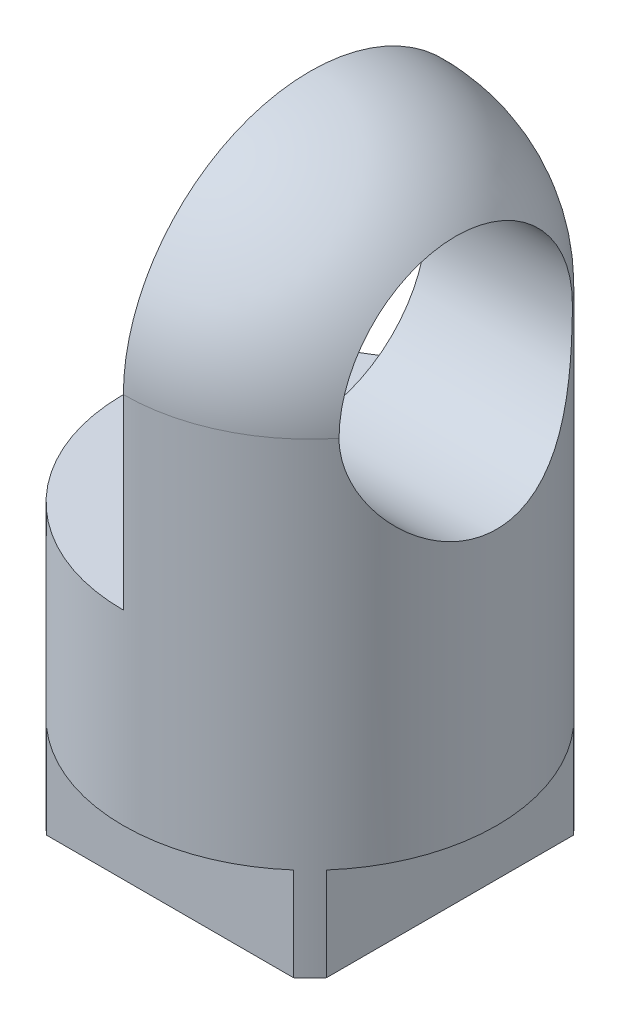
ISO-10303-21;
HEADER;
FILE_DESCRIPTION(('STEP AP214'),'2;1');
FILE_NAME('part.step','',(''),(''),'','','');
FILE_SCHEMA(('AUTOMOTIVE_DESIGN { 1 0 10303 214 1 1 1 1 }'));
ENDSEC;
DATA;
#1=APPLICATION_CONTEXT('core data for automotive mechanical design processes');
#2=APPLICATION_PROTOCOL_DEFINITION('international standard','automotive_design',2000,#1);
#3=PRODUCT_CONTEXT('',#1,'mechanical');
#4=PRODUCT('Part','Part','',(#3));
#5=PRODUCT_RELATED_PRODUCT_CATEGORY('part','',(#4));
#6=PRODUCT_DEFINITION_FORMATION('','',#4);
#7=PRODUCT_DEFINITION_CONTEXT('part definition',#1,'design');
#8=PRODUCT_DEFINITION('design','',#6,#7);
#9=PRODUCT_DEFINITION_SHAPE('','',#8);
#10=(LENGTH_UNIT() NAMED_UNIT(*) SI_UNIT(.MILLI.,.METRE.));
#11=(NAMED_UNIT(*) PLANE_ANGLE_UNIT() SI_UNIT($,.RADIAN.));
#12=(NAMED_UNIT(*) SI_UNIT($,.STERADIAN.) SOLID_ANGLE_UNIT());
#13=UNCERTAINTY_MEASURE_WITH_UNIT(LENGTH_MEASURE(1.E-05),#10,'distance_accuracy_value','');
#14=(GEOMETRIC_REPRESENTATION_CONTEXT(3) GLOBAL_UNCERTAINTY_ASSIGNED_CONTEXT((#13)) GLOBAL_UNIT_ASSIGNED_CONTEXT((#10,
#11,#12)) REPRESENTATION_CONTEXT('',''));
#15=CARTESIAN_POINT('',(0.,0.,0.));
#16=DIRECTION('',(0.,0.,1.));
#17=DIRECTION('',(1.,0.,0.));
#18=AXIS2_PLACEMENT_3D('',#15,#16,#17);
#19=CARTESIAN_POINT('',(0.,12.7,0.));
#20=DIRECTION('',(0.,1.,0.));
#21=DIRECTION('',(-1.,0.,0.));
#22=AXIS2_PLACEMENT_3D('',#19,#20,#21);
#23=CYLINDRICAL_SURFACE('',#22,5.08);
#24=CARTESIAN_POINT('',(0.,0.,0.));
#25=DIRECTION('',(0.,1.,0.));
#26=DIRECTION('',(-1.,0.,0.));
#27=AXIS2_PLACEMENT_3D('',#24,#25,#26);
#28=CIRCLE('',#27,5.08);
#29=CARTESIAN_POINT('',(3.36010416505203,0.,3.81));
#30=VERTEX_POINT('',#29);
#31=CARTESIAN_POINT('',(3.81,0.,3.36010416505203));
#32=VERTEX_POINT('',#31);
#33=EDGE_CURVE('E156',#30,#32,#28,.T.);
#34=ORIENTED_EDGE('',*,*,#33,.T.);
#35=DIRECTION('',(0.,1.,0.));
#36=VECTOR('',#35,1.);
#37=CARTESIAN_POINT('',(3.81,12.7,3.36010416505203));
#38=LINE('',#37,#36);
#39=CARTESIAN_POINT('',(3.81,2.54,3.36010416505203));
#40=VERTEX_POINT('',#39);
#41=EDGE_CURVE('E171',#32,#40,#38,.T.);
#42=ORIENTED_EDGE('',*,*,#41,.T.);
#43=CARTESIAN_POINT('',(0.,2.54,0.));
#44=DIRECTION('',(0.,1.,0.));
#45=DIRECTION('',(0.,0.,1.));
#46=AXIS2_PLACEMENT_3D('',#43,#44,#45);
#47=CIRCLE('',#46,5.08);
#48=CARTESIAN_POINT('',(3.81,2.54,-3.36010416505203));
#49=VERTEX_POINT('',#48);
#50=EDGE_CURVE('E11',#40,#49,#47,.T.);
#51=ORIENTED_EDGE('',*,*,#50,.T.);
#52=DIRECTION('',(0.,1.,0.));
#53=VECTOR('',#52,1.);
#54=CARTESIAN_POINT('',(3.81,12.7,-3.36010416505203));
#55=LINE('',#54,#53);
#56=CARTESIAN_POINT('',(3.81,0.,-3.36010416505203));
#57=VERTEX_POINT('',#56);
#58=EDGE_CURVE('E391',#49,#57,#55,.F.);
#59=ORIENTED_EDGE('',*,*,#58,.T.);
#60=CARTESIAN_POINT('',(3.36010416505203,0.,-3.81));
#61=VERTEX_POINT('',#60);
#62=EDGE_CURVE('E150',#57,#61,#28,.T.);
#63=ORIENTED_EDGE('',*,*,#62,.T.);
#64=DIRECTION('',(0.,1.,0.));
#65=VECTOR('',#64,1.);
#66=CARTESIAN_POINT('',(3.36010416505203,12.7,-3.81));
#67=LINE('',#66,#65);
#68=CARTESIAN_POINT('',(3.36010416505203,2.54,-3.81));
#69=VERTEX_POINT('',#68);
#70=EDGE_CURVE('E65',#69,#61,#67,.F.);
#71=ORIENTED_EDGE('',*,*,#70,.F.);
#72=CARTESIAN_POINT('',(-3.36010416505203,2.54,-3.81));
#73=VERTEX_POINT('',#72);
#74=EDGE_CURVE('E50',#69,#73,#47,.T.);
#75=ORIENTED_EDGE('',*,*,#74,.T.);
#76=DIRECTION('',(0.,1.,0.));
#77=VECTOR('',#76,1.);
#78=CARTESIAN_POINT('',(-3.36010416505203,12.7,-3.81));
#79=LINE('',#78,#77);
#80=CARTESIAN_POINT('',(-3.36010416505203,0.,-3.81));
#81=VERTEX_POINT('',#80);
#82=EDGE_CURVE('E127',#81,#73,#79,.T.);
#83=ORIENTED_EDGE('',*,*,#82,.F.);
#84=CARTESIAN_POINT('',(-3.81,0.,-3.36010416505203));
#85=VERTEX_POINT('',#84);
#86=EDGE_CURVE('E142',#81,#85,#28,.T.);
#87=ORIENTED_EDGE('',*,*,#86,.T.);
#88=DIRECTION('',(0.,1.,0.));
#89=VECTOR('',#88,1.);
#90=CARTESIAN_POINT('',(-3.81,12.7,-3.36010416505203));
#91=LINE('',#90,#89);
#92=CARTESIAN_POINT('',(-3.81,2.54,-3.36010416505203));
#93=VERTEX_POINT('',#92);
#94=EDGE_CURVE('E57',#93,#85,#91,.F.);
#95=ORIENTED_EDGE('',*,*,#94,.F.);
#96=CARTESIAN_POINT('',(-3.81,2.54,3.36010416505203));
#97=VERTEX_POINT('',#96);
#98=EDGE_CURVE('E182',#93,#97,#47,.T.);
#99=ORIENTED_EDGE('',*,*,#98,.T.);
#100=DIRECTION('',(0.,1.,0.));
#101=VECTOR('',#100,1.);
#102=CARTESIAN_POINT('',(-3.81,12.7,3.36010416505203));
#103=LINE('',#102,#101);
#104=CARTESIAN_POINT('',(-3.81,0.,3.36010416505203));
#105=VERTEX_POINT('',#104);
#106=EDGE_CURVE('E405',#105,#97,#103,.T.);
#107=ORIENTED_EDGE('',*,*,#106,.F.);
#108=CARTESIAN_POINT('',(-3.36010416505203,0.,3.81));
#109=VERTEX_POINT('',#108);
#110=EDGE_CURVE('E153',#105,#109,#28,.T.);
#111=ORIENTED_EDGE('',*,*,#110,.T.);
#112=DIRECTION('',(0.,1.,0.));
#113=VECTOR('',#112,1.);
#114=CARTESIAN_POINT('',(-3.36010416505203,12.7,3.81));
#115=LINE('',#114,#113);
#116=CARTESIAN_POINT('',(-3.36010416505203,2.54,3.81));
#117=VERTEX_POINT('',#116);
#118=EDGE_CURVE('E393',#109,#117,#115,.T.);
#119=ORIENTED_EDGE('',*,*,#118,.T.);
#120=CARTESIAN_POINT('',(3.36010416505203,2.54,3.81));
#121=VERTEX_POINT('',#120);
#122=EDGE_CURVE('E44',#117,#121,#47,.T.);
#123=ORIENTED_EDGE('',*,*,#122,.T.);
#124=DIRECTION('',(0.,1.,0.));
#125=VECTOR('',#124,1.);
#126=CARTESIAN_POINT('',(3.36010416505203,12.7,3.81));
#127=LINE('',#126,#125);
#128=EDGE_CURVE('E173',#121,#30,#127,.F.);
#129=ORIENTED_EDGE('',*,*,#128,.T.);
#130=EDGE_LOOP('',(#34,#42,#51,#59,#63,#71,#75,#83,#87,#95,#99,#107,#111,#119,#123,#129));
#131=FACE_BOUND('',#130,.T.);
#132=CARTESIAN_POINT('',(0.,12.7,0.));
#133=DIRECTION('',(0.,1.,0.));
#134=DIRECTION('',(-1.,0.,0.));
#135=AXIS2_PLACEMENT_3D('',#132,#133,#134);
#136=CIRCLE('',#135,5.08);
#137=CARTESIAN_POINT('',(3.96557372898298,12.7,-3.175));
#138=VERTEX_POINT('',#137);
#139=CARTESIAN_POINT('',(0.,12.7,-5.08));
#140=VERTEX_POINT('',#139);
#141=EDGE_CURVE('E162',#138,#140,#136,.T.);
#142=ORIENTED_EDGE('',*,*,#141,.F.);
#143=CARTESIAN_POINT('',(3.96557372898298,12.7,-3.175));
#144=CARTESIAN_POINT('',(3.96553668575496,12.6205118891632,-3.1750187697658));
#145=CARTESIAN_POINT('',(3.96796270587859,12.5410459691146,-3.17201574642022));
#146=CARTESIAN_POINT('',(3.97745784475577,12.3829205182652,-3.16011597778468));
#147=CARTESIAN_POINT('',(3.98452187418947,12.304260199448,-3.15122569253627));
#148=CARTESIAN_POINT('',(4.00293106172696,12.1490062257853,-3.127802564909));
#149=CARTESIAN_POINT('',(4.01423860397452,12.0724005709671,-3.11331926895949));
#150=CARTESIAN_POINT('',(4.04065899806674,11.9210876587645,-3.07895209486733));
#151=CARTESIAN_POINT('',(4.05577272698305,11.8463808433099,-3.05906697188136));
#152=CARTESIAN_POINT('',(4.10586018242097,11.6264063356626,-2.99189347269355));
#153=CARTESIAN_POINT('',(4.14568267987246,11.4845009197178,-2.93696488170395));
#154=CARTESIAN_POINT('',(4.23363099607258,11.2118352331035,-2.80870324977392));
#155=CARTESIAN_POINT('',(4.28177726022103,11.0811036185818,-2.73532468421232));
#156=CARTESIAN_POINT('',(4.38861555354015,10.8156349938689,-2.56090465668066));
#157=CARTESIAN_POINT('',(4.44785842960661,10.6826788735131,-2.45748173299343));
#158=CARTESIAN_POINT('',(4.56574853837926,10.4345637702691,-2.2308537354882));
#159=CARTESIAN_POINT('',(4.62439553592428,10.3194115768122,-2.107641151329));
#160=CARTESIAN_POINT('',(4.74293376739633,10.0962252367574,-1.82669693037059));
#161=CARTESIAN_POINT('',(4.80211852737148,9.99073392818562,-1.66659303565518));
#162=CARTESIAN_POINT('',(4.88069787250447,9.85451479801774,-1.41178991041131));
#163=CARTESIAN_POINT('',(4.90519760483987,9.8127681594814,-1.32438379192686));
#164=CARTESIAN_POINT('',(4.95008316597792,9.7371498700146,-1.14523985655597));
#165=CARTESIAN_POINT('',(4.9704718365154,9.70327277685071,-1.05350508631344));
#166=CARTESIAN_POINT('',(5.00464782592636,9.64694057414909,-0.875919456573036));
#167=CARTESIAN_POINT('',(5.018894379992,9.62367653268437,-0.790412578673272));
#168=CARTESIAN_POINT('',(5.04312223051952,9.58430616521734,-0.617217250291774));
#169=CARTESIAN_POINT('',(5.05310598952021,9.56819570650549,-0.529530090387908));
#170=CARTESIAN_POINT('',(5.06851244575877,9.5433975208991,-0.352762535037775));
#171=CARTESIAN_POINT('',(5.07393795439694,9.53470521864252,-0.263683032938001));
#172=CARTESIAN_POINT('',(5.08007778745085,9.52487399982992,-0.0849777047656704));
#173=CARTESIAN_POINT('',(5.0807926541362,9.52373421385943,0.00464805723474299));
#174=CARTESIAN_POINT('',(5.07624689021295,9.53100123114147,0.248977181991278));
#175=CARTESIAN_POINT('',(5.06624641734615,9.54697928851916,0.40345581163355));
#176=CARTESIAN_POINT('',(5.03289450623881,9.60085729456019,0.706928183947302));
#177=CARTESIAN_POINT('',(5.00954204591595,9.63875892145516,0.855921505794065));
#178=CARTESIAN_POINT('',(4.95142655443309,9.73481631277104,1.14525432498885));
#179=CARTESIAN_POINT('',(4.91663404959704,9.79302441787137,1.28557034521797));
#180=CARTESIAN_POINT('',(4.83833326570713,9.92751369609217,1.55453752187429));
#181=CARTESIAN_POINT('',(4.79482346096385,10.0037980333166,1.68318663064181));
#182=CARTESIAN_POINT('',(4.6962961870067,10.1829178381142,1.94234884216889));
#183=CARTESIAN_POINT('',(4.64052057602974,10.2878748368373,2.07110651896006));
#184=CARTESIAN_POINT('',(4.52618792094146,10.5158827009064,2.31033793468988));
#185=CARTESIAN_POINT('',(4.46762601571075,10.6389660372124,2.42077808916699));
#186=CARTESIAN_POINT('',(4.34513887339685,10.9189038007104,2.63501018081984));
#187=CARTESIAN_POINT('',(4.28152109901661,11.0780707488094,2.73601785648001));
#188=CARTESIAN_POINT('',(4.19470545974723,11.3303372169517,2.86593372296078));
#189=CARTESIAN_POINT('',(4.16722823673247,11.4165738760507,2.90560711905144));
#190=CARTESIAN_POINT('',(4.11625294350117,11.5932461145547,2.97738017894082));
#191=CARTESIAN_POINT('',(4.09275160693284,11.68367816867,3.00948606836504));
#192=CARTESIAN_POINT('',(4.05517306813677,11.8492613231588,3.05986096965577));
#193=CARTESIAN_POINT('',(4.04015151928276,11.9237491199233,3.07961715063565));
#194=CARTESIAN_POINT('',(4.01390103952476,12.0745866550977,3.11375328898331));
#195=CARTESIAN_POINT('',(4.00267066936423,12.1509356750965,3.12813528679055));
#196=CARTESIAN_POINT('',(3.98438913827534,12.3056532829258,3.15139303049864));
#197=CARTESIAN_POINT('',(3.97737485192845,12.3840336088279,3.160220223687));
#198=CARTESIAN_POINT('',(3.96794588380327,12.5416017685572,3.17203674317549));
#199=CARTESIAN_POINT('',(3.9655368753038,12.6207904777237,3.1750188690043));
#200=CARTESIAN_POINT('',(3.96557372898298,12.7,3.175));
#201=B_SPLINE_CURVE_WITH_KNOTS('',3,(#143,#144,#145,#146,#147,#148,#149,#150,#151,#152,#153,
#154,#155,#156,#157,#158,#159,#160,#161,#162,#163,#164,#165,#166,#167,#168,#169,#170,#171,#172,
#173,#174,#175,#176,#177,#178,#179,#180,#181,#182,#183,#184,#185,#186,#187,#188,#189,#190,#191,
#192,#193,#194,#195,#196,#197,#198,#199,#200),.UNSPECIFIED.,.F.,.F.,(4,2,2,2,2,2,2,2,2,2,2,2,2,
2,2,2,2,2,2,2,2,2,2,2,2,2,2,2,4),(0.,0.238334741399563,0.476408392535931,0.71241970352417,
0.948485449188425,1.41824833158815,1.88918191081541,2.42276642713652,2.95655392380115,
3.55486271540028,3.85421010178217,4.15334985218028,4.42221814058601,4.69093089785872,
4.95947779875706,5.22799378510857,5.69240313299306,6.15684803574556,6.62249901642669,
7.08823156598375,7.61184583570854,8.13640976603913,8.7299577061444,9.02606457277424,
9.32192698169444,9.55719884046868,9.79238128157409,10.0295918199097,10.2670943919785),.UNSPECIFIED.);
#202=CARTESIAN_POINT('',(3.96557372898298,12.7,3.175));
#203=VERTEX_POINT('',#202);
#204=EDGE_CURVE('E207',#138,#203,#201,.T.);
#205=ORIENTED_EDGE('',*,*,#204,.T.);
#206=CARTESIAN_POINT('',(0.,12.7,5.08));
#207=VERTEX_POINT('',#206);
#208=EDGE_CURVE('E167',#207,#203,#136,.T.);
#209=ORIENTED_EDGE('',*,*,#208,.F.);
#210=DIRECTION('',(0.,1.,0.));
#211=VECTOR('',#210,1.);
#212=CARTESIAN_POINT('',(0.,12.7,5.08));
#213=LINE('',#212,#211);
#214=CARTESIAN_POINT('',(0.,7.62,5.08));
#215=VERTEX_POINT('',#214);
#216=EDGE_CURVE('E194',#215,#207,#213,.T.);
#217=ORIENTED_EDGE('',*,*,#216,.F.);
#218=CARTESIAN_POINT('',(0.,7.62,0.));
#219=DIRECTION('',(0.,1.,0.));
#220=DIRECTION('',(-1.,0.,0.));
#221=AXIS2_PLACEMENT_3D('',#218,#219,#220);
#222=CIRCLE('',#221,5.08);
#223=CARTESIAN_POINT('',(0.,7.62,-5.08));
#224=VERTEX_POINT('',#223);
#225=EDGE_CURVE('E190',#224,#215,#222,.T.);
#226=ORIENTED_EDGE('',*,*,#225,.F.);
#227=DIRECTION('',(0.,1.,0.));
#228=VECTOR('',#227,1.);
#229=CARTESIAN_POINT('',(0.,12.7,-5.08));
#230=LINE('',#229,#228);
#231=EDGE_CURVE('E135',#224,#140,#230,.T.);
#232=ORIENTED_EDGE('',*,*,#231,.T.);
#233=EDGE_LOOP('',(#142,#205,#209,#217,#226,#232));
#234=FACE_BOUND('',#233,.T.);
#235=ADVANCED_FACE('F40',(#131,#234),#23,.T.);
#236=CARTESIAN_POINT('',(0.,0.,0.));
#237=DIRECTION('',(0.,-1.,0.));
#238=DIRECTION('',(1.,0.,0.));
#239=AXIS2_PLACEMENT_3D('',#236,#237,#238);
#240=PLANE('',#239);
#241=DIRECTION('',(0.,0.,-1.));
#242=VECTOR('',#241,1.);
#243=CARTESIAN_POINT('',(3.81,0.,0.));
#244=LINE('',#243,#242);
#245=EDGE_CURVE('E176',#32,#57,#244,.T.);
#246=ORIENTED_EDGE('',*,*,#245,.F.);
#247=ORIENTED_EDGE('',*,*,#33,.F.);
#248=DIRECTION('',(1.,0.,0.));
#249=VECTOR('',#248,1.);
#250=CARTESIAN_POINT('',(0.,0.,3.81));
#251=LINE('',#250,#249);
#252=EDGE_CURVE('E175',#109,#30,#251,.T.);
#253=ORIENTED_EDGE('',*,*,#252,.F.);
#254=ORIENTED_EDGE('',*,*,#110,.F.);
#255=DIRECTION('',(0.,0.,-1.));
#256=VECTOR('',#255,1.);
#257=CARTESIAN_POINT('',(-3.81,0.,0.));
#258=LINE('',#257,#256);
#259=EDGE_CURVE('E134',#105,#85,#258,.T.);
#260=ORIENTED_EDGE('',*,*,#259,.T.);
#261=ORIENTED_EDGE('',*,*,#86,.F.);
#262=DIRECTION('',(1.,0.,0.));
#263=VECTOR('',#262,1.);
#264=CARTESIAN_POINT('',(0.,0.,-3.81));
#265=LINE('',#264,#263);
#266=EDGE_CURVE('E124',#81,#61,#265,.T.);
#267=ORIENTED_EDGE('',*,*,#266,.T.);
#268=ORIENTED_EDGE('',*,*,#62,.F.);
#269=EDGE_LOOP('',(#246,#247,#253,#254,#260,#261,#267,#268));
#270=FACE_BOUND('',#269,.T.);
#271=CARTESIAN_POINT('',(0.,0.,0.));
#272=DIRECTION('',(0.,-1.,0.));
#273=DIRECTION('',(1.,0.,0.));
#274=AXIS2_PLACEMENT_3D('',#271,#272,#273);
#275=CIRCLE('',#274,3.175);
#276=CARTESIAN_POINT('',(3.175,0.,0.));
#277=VERTEX_POINT('',#276);
#278=EDGE_CURVE('E215',#277,#277,#275,.T.);
#279=ORIENTED_EDGE('',*,*,#278,.F.);
#280=EDGE_LOOP('',(#279));
#281=FACE_BOUND('',#280,.T.);
#282=ADVANCED_FACE('F146',(#270,#281),#240,.T.);
#283=CARTESIAN_POINT('',(0.,12.7,0.));
#284=DIRECTION('',(0.,1.,0.));
#285=DIRECTION('',(1.,0.,0.));
#286=AXIS2_PLACEMENT_3D('',#283,#284,#285);
#287=SPHERICAL_SURFACE('',#286,5.08);
#288=CARTESIAN_POINT('',(3.96557372898298,12.7,0.));
#289=DIRECTION('',(-1.,0.,0.));
#290=DIRECTION('',(0.,0.,1.));
#291=AXIS2_PLACEMENT_3D('',#288,#289,#290);
#292=CIRCLE('',#291,3.175);
#293=EDGE_CURVE('E203',#138,#203,#292,.F.);
#294=ORIENTED_EDGE('',*,*,#293,.F.);
#295=ORIENTED_EDGE('',*,*,#141,.T.);
#296=CARTESIAN_POINT('',(0.,12.7,0.));
#297=DIRECTION('',(-1.,0.,0.));
#298=DIRECTION('',(0.,0.,1.));
#299=AXIS2_PLACEMENT_3D('',#296,#297,#298);
#300=CIRCLE('',#299,5.08);
#301=EDGE_CURVE('E151',#140,#207,#300,.F.);
#302=ORIENTED_EDGE('',*,*,#301,.T.);
#303=ORIENTED_EDGE('',*,*,#208,.T.);
#304=EDGE_LOOP('',(#294,#295,#302,#303));
#305=FACE_BOUND('',#304,.T.);
#306=ADVANCED_FACE('F42',(#305),#287,.T.);
#307=CARTESIAN_POINT('',(0.,7.62,-5.08));
#308=DIRECTION('',(0.,1.,0.));
#309=DIRECTION('',(-1.,0.,0.));
#310=AXIS2_PLACEMENT_3D('',#307,#308,#309);
#311=PLANE('',#310);
#312=ORIENTED_EDGE('',*,*,#225,.T.);
#313=DIRECTION('',(0.,0.,1.));
#314=VECTOR('',#313,1.);
#315=CARTESIAN_POINT('',(0.,7.62,-5.08));
#316=LINE('',#315,#314);
#317=EDGE_CURVE('E157',#224,#215,#316,.T.);
#318=ORIENTED_EDGE('',*,*,#317,.F.);
#319=EDGE_LOOP('',(#312,#318));
#320=FACE_BOUND('',#319,.T.);
#321=ADVANCED_FACE('F237',(#320),#311,.T.);
#322=CARTESIAN_POINT('',(0.,0.,-5.08));
#323=DIRECTION('',(-1.,0.,0.));
#324=DIRECTION('',(0.,0.,1.));
#325=AXIS2_PLACEMENT_3D('',#322,#323,#324);
#326=PLANE('',#325);
#327=CARTESIAN_POINT('',(0.,12.7,0.));
#328=DIRECTION('',(-1.,0.,0.));
#329=DIRECTION('',(0.,0.,1.));
#330=AXIS2_PLACEMENT_3D('',#327,#328,#329);
#331=CIRCLE('',#330,3.175);
#332=CARTESIAN_POINT('',(0.,12.7,3.175));
#333=VERTEX_POINT('',#332);
#334=EDGE_CURVE('E210',#333,#333,#331,.T.);
#335=ORIENTED_EDGE('',*,*,#334,.F.);
#336=EDGE_LOOP('',(#335));
#337=FACE_BOUND('',#336,.T.);
#338=ORIENTED_EDGE('',*,*,#231,.F.);
#339=ORIENTED_EDGE('',*,*,#317,.T.);
#340=ORIENTED_EDGE('',*,*,#216,.T.);
#341=ORIENTED_EDGE('',*,*,#301,.F.);
#342=EDGE_LOOP('',(#338,#339,#340,#341));
#343=FACE_BOUND('',#342,.T.);
#344=ADVANCED_FACE('F235',(#337,#343),#326,.T.);
#345=CARTESIAN_POINT('',(0.,6.35,0.));
#346=DIRECTION('',(0.,-1.,0.));
#347=DIRECTION('',(1.,0.,0.));
#348=AXIS2_PLACEMENT_3D('',#345,#346,#347);
#349=CYLINDRICAL_SURFACE('',#348,3.175);
#350=CARTESIAN_POINT('',(0.,6.35,0.));
#351=DIRECTION('',(0.,-1.,0.));
#352=DIRECTION('',(1.,0.,0.));
#353=AXIS2_PLACEMENT_3D('',#350,#351,#352);
#354=CIRCLE('',#353,3.175);
#355=CARTESIAN_POINT('',(3.175,6.35,0.));
#356=VERTEX_POINT('',#355);
#357=EDGE_CURVE('E219',#356,#356,#354,.T.);
#358=ORIENTED_EDGE('',*,*,#357,.F.);
#359=EDGE_LOOP('',(#358));
#360=FACE_BOUND('',#359,.T.);
#361=ORIENTED_EDGE('',*,*,#278,.T.);
#362=EDGE_LOOP('',(#361));
#363=FACE_BOUND('',#362,.T.);
#364=ADVANCED_FACE('F244',(#360,#363),#349,.F.);
#365=CARTESIAN_POINT('',(0.,6.35,0.));
#366=DIRECTION('',(0.,-1.,0.));
#367=DIRECTION('',(1.,0.,0.));
#368=AXIS2_PLACEMENT_3D('',#365,#366,#367);
#369=PLANE('',#368);
#370=ORIENTED_EDGE('',*,*,#357,.T.);
#371=EDGE_LOOP('',(#370));
#372=FACE_BOUND('',#371,.T.);
#373=ADVANCED_FACE('F336',(#372),#369,.T.);
#374=CARTESIAN_POINT('',(5.08,12.7,0.));
#375=DIRECTION('',(-1.,0.,0.));
#376=DIRECTION('',(0.,0.,1.));
#377=AXIS2_PLACEMENT_3D('',#374,#375,#376);
#378=CYLINDRICAL_SURFACE('',#377,3.175);
#379=ORIENTED_EDGE('',*,*,#293,.T.);
#380=ORIENTED_EDGE('',*,*,#204,.F.);
#381=EDGE_LOOP('',(#379,#380));
#382=FACE_BOUND('',#381,.T.);
#383=ORIENTED_EDGE('',*,*,#334,.T.);
#384=EDGE_LOOP('',(#383));
#385=FACE_BOUND('',#384,.T.);
#386=ADVANCED_FACE('F212',(#382,#385),#378,.F.);
#387=CARTESIAN_POINT('',(0.,2.54,-3.81));
#388=DIRECTION('',(0.,0.,-1.));
#389=DIRECTION('',(-1.,0.,0.));
#390=AXIS2_PLACEMENT_3D('',#387,#388,#389);
#391=PLANE('',#390);
#392=ORIENTED_EDGE('',*,*,#82,.T.);
#393=DIRECTION('',(1.,0.,0.));
#394=VECTOR('',#393,1.);
#395=CARTESIAN_POINT('',(0.,2.54,-3.81));
#396=LINE('',#395,#394);
#397=EDGE_CURVE('E412',#73,#69,#396,.T.);
#398=ORIENTED_EDGE('',*,*,#397,.T.);
#399=ORIENTED_EDGE('',*,*,#70,.T.);
#400=ORIENTED_EDGE('',*,*,#266,.F.);
#401=EDGE_LOOP('',(#392,#398,#399,#400));
#402=FACE_BOUND('',#401,.T.);
#403=ADVANCED_FACE('F126',(#402),#391,.T.);
#404=CARTESIAN_POINT('',(0.,2.54,0.));
#405=DIRECTION('',(0.,1.,0.));
#406=DIRECTION('',(0.,0.,1.));
#407=AXIS2_PLACEMENT_3D('',#404,#405,#406);
#408=PLANE('',#407);
#409=ORIENTED_EDGE('',*,*,#397,.F.);
#410=ORIENTED_EDGE('',*,*,#74,.F.);
#411=EDGE_LOOP('',(#409,#410));
#412=FACE_BOUND('',#411,.T.);
#413=ADVANCED_FACE('F265',(#412),#408,.F.);
#414=CARTESIAN_POINT('',(-3.81,2.54,0.));
#415=DIRECTION('',(-1.,0.,0.));
#416=DIRECTION('',(0.,0.,1.));
#417=AXIS2_PLACEMENT_3D('',#414,#415,#416);
#418=PLANE('',#417);
#419=ORIENTED_EDGE('',*,*,#106,.T.);
#420=DIRECTION('',(0.,0.,-1.));
#421=VECTOR('',#420,1.);
#422=CARTESIAN_POINT('',(-3.81,2.54,0.));
#423=LINE('',#422,#421);
#424=EDGE_CURVE('E415',#97,#93,#423,.T.);
#425=ORIENTED_EDGE('',*,*,#424,.T.);
#426=ORIENTED_EDGE('',*,*,#94,.T.);
#427=ORIENTED_EDGE('',*,*,#259,.F.);
#428=EDGE_LOOP('',(#419,#425,#426,#427));
#429=FACE_BOUND('',#428,.T.);
#430=ADVANCED_FACE('F275',(#429),#418,.T.);
#431=ORIENTED_EDGE('',*,*,#424,.F.);
#432=ORIENTED_EDGE('',*,*,#98,.F.);
#433=EDGE_LOOP('',(#431,#432));
#434=FACE_BOUND('',#433,.T.);
#435=ADVANCED_FACE('F278',(#434),#408,.F.);
#436=CARTESIAN_POINT('',(0.,2.54,3.81));
#437=DIRECTION('',(0.,0.,-1.));
#438=DIRECTION('',(-1.,0.,0.));
#439=AXIS2_PLACEMENT_3D('',#436,#437,#438);
#440=PLANE('',#439);
#441=ORIENTED_EDGE('',*,*,#252,.T.);
#442=ORIENTED_EDGE('',*,*,#128,.F.);
#443=DIRECTION('',(1.,0.,0.));
#444=VECTOR('',#443,1.);
#445=CARTESIAN_POINT('',(0.,2.54,3.81));
#446=LINE('',#445,#444);
#447=EDGE_CURVE('E389',#117,#121,#446,.T.);
#448=ORIENTED_EDGE('',*,*,#447,.F.);
#449=ORIENTED_EDGE('',*,*,#118,.F.);
#450=EDGE_LOOP('',(#441,#442,#448,#449));
#451=FACE_BOUND('',#450,.T.);
#452=ADVANCED_FACE('F295',(#451),#440,.F.);
#453=ORIENTED_EDGE('',*,*,#447,.T.);
#454=ORIENTED_EDGE('',*,*,#122,.F.);
#455=EDGE_LOOP('',(#453,#454));
#456=FACE_BOUND('',#455,.T.);
#457=ADVANCED_FACE('F297',(#456),#408,.F.);
#458=DIRECTION('',(0.,0.,-1.));
#459=VECTOR('',#458,1.);
#460=CARTESIAN_POINT('',(3.81,2.54,0.));
#461=LINE('',#460,#459);
#462=EDGE_CURVE('E387',#40,#49,#461,.T.);
#463=ORIENTED_EDGE('',*,*,#462,.T.);
#464=ORIENTED_EDGE('',*,*,#50,.F.);
#465=EDGE_LOOP('',(#463,#464));
#466=FACE_BOUND('',#465,.T.);
#467=ADVANCED_FACE('F279',(#466),#408,.F.);
#468=CARTESIAN_POINT('',(3.81,2.54,0.));
#469=DIRECTION('',(-1.,0.,0.));
#470=DIRECTION('',(0.,0.,1.));
#471=AXIS2_PLACEMENT_3D('',#468,#469,#470);
#472=PLANE('',#471);
#473=ORIENTED_EDGE('',*,*,#245,.T.);
#474=ORIENTED_EDGE('',*,*,#58,.F.);
#475=ORIENTED_EDGE('',*,*,#462,.F.);
#476=ORIENTED_EDGE('',*,*,#41,.F.);
#477=EDGE_LOOP('',(#473,#474,#475,#476));
#478=FACE_BOUND('',#477,.T.);
#479=ADVANCED_FACE('F322',(#478),#472,.F.);
#480=CLOSED_SHELL('',(#235,#282,#306,#321,#344,#364,#373,#386,#403,#413,#430,#435,#452,#457,
#467,#479));
#481=MANIFOLD_SOLID_BREP('B2',#480);
#482=ADVANCED_BREP_SHAPE_REPRESENTATION('',(#18,#481),#14);
#483=SHAPE_DEFINITION_REPRESENTATION(#9,#482);
ENDSEC;
END-ISO-10303-21;
